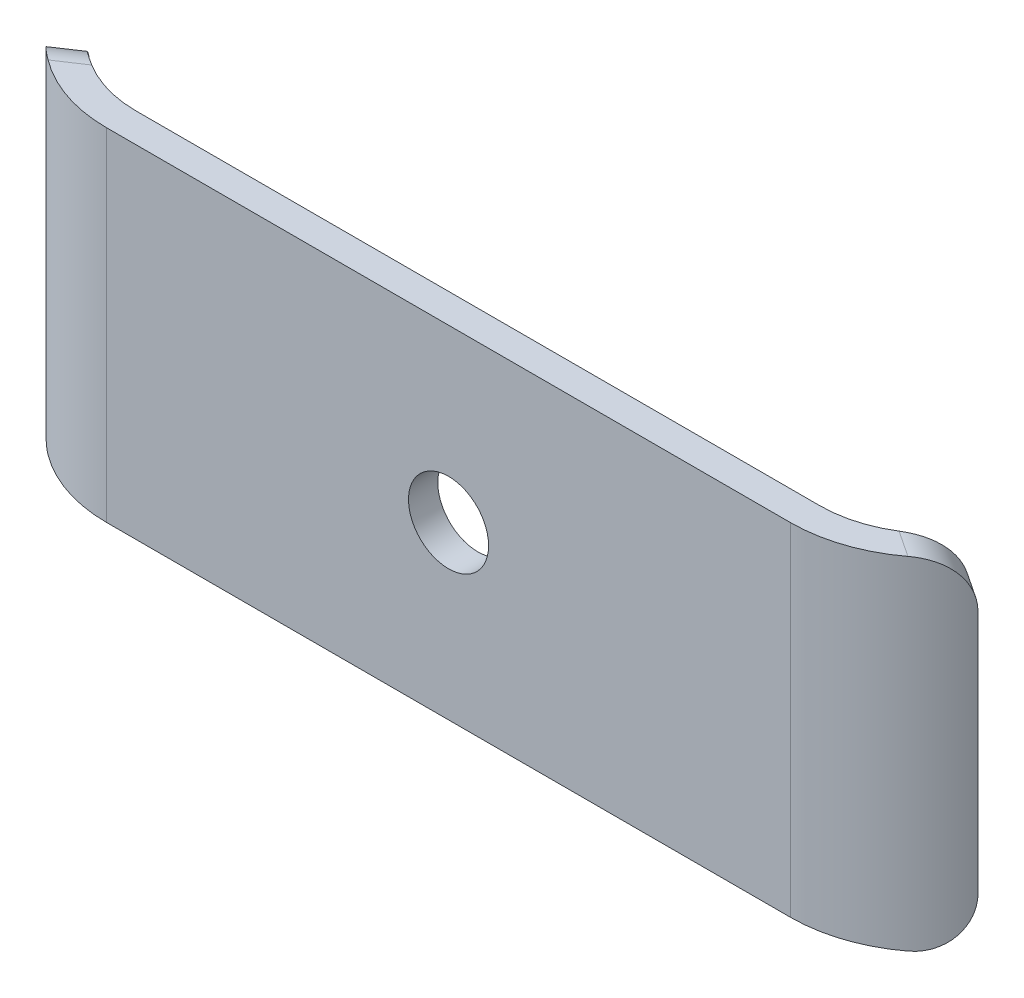
ISO-10303-21;
HEADER;
FILE_DESCRIPTION(('STEP AP214'),'2;1');
FILE_NAME('part.step','',(''),(''),'','','');
FILE_SCHEMA(('AUTOMOTIVE_DESIGN { 1 0 10303 214 1 1 1 1 }'));
ENDSEC;
DATA;
#1=APPLICATION_CONTEXT('core data for automotive mechanical design processes');
#2=APPLICATION_PROTOCOL_DEFINITION('international standard','automotive_design',2000,#1);
#3=PRODUCT_CONTEXT('',#1,'mechanical');
#4=PRODUCT('Part','Part','',(#3));
#5=PRODUCT_RELATED_PRODUCT_CATEGORY('part','',(#4));
#6=PRODUCT_DEFINITION_FORMATION('','',#4);
#7=PRODUCT_DEFINITION_CONTEXT('part definition',#1,'design');
#8=PRODUCT_DEFINITION('design','',#6,#7);
#9=PRODUCT_DEFINITION_SHAPE('','',#8);
#10=(LENGTH_UNIT() NAMED_UNIT(*) SI_UNIT(.MILLI.,.METRE.));
#11=(NAMED_UNIT(*) PLANE_ANGLE_UNIT() SI_UNIT($,.RADIAN.));
#12=(NAMED_UNIT(*) SI_UNIT($,.STERADIAN.) SOLID_ANGLE_UNIT());
#13=UNCERTAINTY_MEASURE_WITH_UNIT(LENGTH_MEASURE(1.E-05),#10,'distance_accuracy_value','');
#14=(GEOMETRIC_REPRESENTATION_CONTEXT(3) GLOBAL_UNCERTAINTY_ASSIGNED_CONTEXT((#13)) GLOBAL_UNIT_ASSIGNED_CONTEXT((#10,
#11,#12)) REPRESENTATION_CONTEXT('',''));
#15=CARTESIAN_POINT('',(0.,0.,0.));
#16=DIRECTION('',(0.,0.,1.));
#17=DIRECTION('',(1.,0.,0.));
#18=AXIS2_PLACEMENT_3D('',#15,#16,#17);
#19=CARTESIAN_POINT('',(-10.6944444444444,35.,-16.1224816197832));
#20=DIRECTION('',(-0.552770798392565,0.,-0.833333333333334));
#21=DIRECTION('',(-0.833333333333334,0.,0.552770798392566));
#22=AXIS2_PLACEMENT_3D('',#19,#20,#21);
#23=PLANE('',#22);
#24=DIRECTION('',(0.,-1.,0.));
#25=VECTOR('',#24,1.);
#26=CARTESIAN_POINT('',(-45.,35.,6.6332495807108));
#27=LINE('',#26,#25);
#28=CARTESIAN_POINT('',(-45.,30.,6.6332495807108));
#29=VERTEX_POINT('',#28);
#30=CARTESIAN_POINT('',(-45.,5.,6.6332495807108));
#31=VERTEX_POINT('',#30);
#32=EDGE_CURVE('E165',#29,#31,#27,.T.);
#33=ORIENTED_EDGE('',*,*,#32,.T.);
#34=DIRECTION('',(0.833333333333334,0.,-0.552770798392566));
#35=VECTOR('',#34,1.);
#36=CARTESIAN_POINT('',(-47.5,5.,8.2915619758885));
#37=LINE('',#36,#35);
#38=CARTESIAN_POINT('',(-47.5,5.,8.29156197588849));
#39=VERTEX_POINT('',#38);
#40=EDGE_CURVE('E55',#31,#39,#37,.F.);
#41=ORIENTED_EDGE('',*,*,#40,.T.);
#42=DIRECTION('',(0.,-1.,0.));
#43=VECTOR('',#42,1.);
#44=CARTESIAN_POINT('',(-47.5,35.,8.29156197588849));
#45=LINE('',#44,#43);
#46=CARTESIAN_POINT('',(-47.5,30.,8.29156197588849));
#47=VERTEX_POINT('',#46);
#48=EDGE_CURVE('E146',#47,#39,#45,.T.);
#49=ORIENTED_EDGE('',*,*,#48,.F.);
#50=DIRECTION('',(0.833333333333334,0.,-0.552770798392566));
#51=VECTOR('',#50,1.);
#52=CARTESIAN_POINT('',(-10.6944444444444,30.,-16.1224816197832));
#53=LINE('',#52,#51);
#54=EDGE_CURVE('E238',#47,#29,#53,.T.);
#55=ORIENTED_EDGE('',*,*,#54,.T.);
#56=EDGE_LOOP('',(#33,#41,#49,#55));
#57=FACE_BOUND('',#56,.T.);
#58=ADVANCED_FACE('F34',(#57),#23,.T.);
#59=CARTESIAN_POINT('',(-35.,35.,0.));
#60=DIRECTION('',(0.,-1.,0.));
#61=DIRECTION('',(0.,0.,-1.));
#62=AXIS2_PLACEMENT_3D('',#59,#60,#61);
#63=CYLINDRICAL_SURFACE('',#62,15.);
#64=ORIENTED_EDGE('',*,*,#48,.T.);
#65=CARTESIAN_POINT('',(-47.5,5.,8.2915619758885));
#66=CARTESIAN_POINT('',(-47.4999959600044,4.85952450066098,8.29154122913177));
#67=CARTESIAN_POINT('',(-47.4967275518829,4.71905115037134,8.29649453402392));
#68=CARTESIAN_POINT('',(-47.4836327346472,4.43910666598075,8.31619940728788));
#69=CARTESIAN_POINT('',(-47.4738066094585,4.29963548875356,8.33095055144841));
#70=CARTESIAN_POINT('',(-47.4475744420987,4.02275844835668,8.37009032989537));
#71=CARTESIAN_POINT('',(-47.4311720862223,3.88535147279545,8.39447356481753));
#72=CARTESIAN_POINT('',(-47.391732997827,3.61349931940472,8.45258502694666));
#73=CARTESIAN_POINT('',(-47.3686963468768,3.47905410518229,8.4863131392583));
#74=CARTESIAN_POINT('',(-47.3159121170527,3.21403082621614,8.56273683368021));
#75=CARTESIAN_POINT('',(-47.2861620687271,3.08345420453843,8.60543571519279));
#76=CARTESIAN_POINT('',(-47.2198706008423,2.82710507547343,8.69931400271356));
#77=CARTESIAN_POINT('',(-47.1833266754307,2.70133436139781,8.75049653707305));
#78=CARTESIAN_POINT('',(-47.1034068614244,2.45561532332307,8.86070938738571));
#79=CARTESIAN_POINT('',(-47.0600344493512,2.3356640769469,8.91973570753619));
#80=CARTESIAN_POINT('',(-46.9663774914936,2.10234451763328,9.04499443933699));
#81=CARTESIAN_POINT('',(-46.916090575915,1.98897848066212,9.1112293199336));
#82=CARTESIAN_POINT('',(-46.8088544055107,1.77022630840382,9.2497887845322));
#83=CARTESIAN_POINT('',(-46.7519380593788,1.66480470272382,9.3220828275773));
#84=CARTESIAN_POINT('',(-46.6312832131432,1.46211617420222,9.47219723110539));
#85=CARTESIAN_POINT('',(-46.5675448473463,1.36484909088774,9.5500174827824));
#86=CARTESIAN_POINT('',(-46.4333414512651,1.17917693624183,9.71028442248719));
#87=CARTESIAN_POINT('',(-46.3628767097675,1.09077148478347,9.79273091183189));
#88=CARTESIAN_POINT('',(-46.2154167685201,0.923477300848391,9.96127282448771));
#89=CARTESIAN_POINT('',(-46.1384240276875,0.844585011910064,10.0473668678059));
#90=CARTESIAN_POINT('',(-45.9796303128965,0.698182074974766,10.220629508476));
#91=CARTESIAN_POINT('',(-45.8979447010034,0.630487802322419,10.3077487280714));
#92=CARTESIAN_POINT('',(-45.7288785966837,0.505169925591379,10.4836079869945));
#93=CARTESIAN_POINT('',(-45.6415001937351,0.447542654799769,10.5723474231271));
#94=CARTESIAN_POINT('',(-45.4614002029752,0.34259613523206,10.7505884638469));
#95=CARTESIAN_POINT('',(-45.3686764912054,0.295281020191002,10.8400903591904));
#96=CARTESIAN_POINT('',(-45.1784626372279,0.211164264547766,11.0188911730773));
#97=CARTESIAN_POINT('',(-45.0809732614986,0.174360939770351,11.1081901218593));
#98=CARTESIAN_POINT('',(-44.8295222173874,0.094789713742336,11.3323303036856));
#99=CARTESIAN_POINT('',(-44.6727119550066,0.058983582434993,11.4665430070342));
#100=CARTESIAN_POINT('',(-44.4320644258624,0.0234434131472821,11.6639173234658));
#101=CARTESIAN_POINT('',(-44.3510012699965,0.0146246945527784,11.7290075694377));
#102=CARTESIAN_POINT('',(-44.1872718276632,0.0029039503455175,11.8576927202707));
#103=CARTESIAN_POINT('',(-44.1046055080057,2.04735980151942E-06,11.921287594113));
#104=CARTESIAN_POINT('',(-44.021259027813,0.,11.9840262663724));
#105=B_SPLINE_CURVE_WITH_KNOTS('',3,(#65,#66,#67,#68,#69,#70,#71,#72,#73,#74,#75,#76,#77,#78,
#79,#80,#81,#82,#83,#84,#85,#86,#87,#88,#89,#90,#91,#92,#93,#94,#95,#96,#97,#98,#99,#100,#101,
#102,#103,#104),.UNSPECIFIED.,.F.,.F.,(4,2,2,2,2,2,2,2,2,2,2,2,2,2,2,2,2,2,2,4),(0.,
0.421298173617721,0.842578107725069,1.26362222352308,1.68466116281056,2.10585522997914,
2.52720495962193,2.9483408611492,3.36962145921057,3.78889342404062,4.20815713607819,
4.62740285575349,5.0464913527826,5.45782348433233,5.86900548222117,6.28035200476779,
6.69163258528923,7.31819571357399,7.63104404912889,7.94389886845451),.UNSPECIFIED.);
#106=CARTESIAN_POINT('',(-44.021259027813,0.,11.9840262663724));
#107=VERTEX_POINT('',#106);
#108=EDGE_CURVE('E11',#39,#107,#105,.T.);
#109=ORIENTED_EDGE('',*,*,#108,.T.);
#110=CARTESIAN_POINT('',(-35.,0.,0.));
#111=DIRECTION('',(0.,1.,0.));
#112=DIRECTION('',(0.,0.,1.));
#113=AXIS2_PLACEMENT_3D('',#110,#111,#112);
#114=CIRCLE('',#113,15.);
#115=CARTESIAN_POINT('',(-35.,0.,15.));
#116=VERTEX_POINT('',#115);
#117=EDGE_CURVE('E143',#107,#116,#114,.T.);
#118=ORIENTED_EDGE('',*,*,#117,.T.);
#119=DIRECTION('',(0.,-1.,0.));
#120=VECTOR('',#119,1.);
#121=CARTESIAN_POINT('',(-35.,35.,15.));
#122=LINE('',#121,#120);
#123=CARTESIAN_POINT('',(-35.,35.,15.));
#124=VERTEX_POINT('',#123);
#125=EDGE_CURVE('E140',#124,#116,#122,.T.);
#126=ORIENTED_EDGE('',*,*,#125,.F.);
#127=CARTESIAN_POINT('',(-35.,35.,0.));
#128=DIRECTION('',(0.,1.,0.));
#129=DIRECTION('',(0.,0.,1.));
#130=AXIS2_PLACEMENT_3D('',#127,#128,#129);
#131=CIRCLE('',#130,15.);
#132=CARTESIAN_POINT('',(-44.021259027813,35.,11.9840262663724));
#133=VERTEX_POINT('',#132);
#134=EDGE_CURVE('E127',#133,#124,#131,.T.);
#135=ORIENTED_EDGE('',*,*,#134,.F.);
#136=CARTESIAN_POINT('',(-44.021259027813,35.,11.9840262663724));
#137=CARTESIAN_POINT('',(-44.1330426986423,35.0000160469528,11.8999005498065));
#138=CARTESIAN_POINT('',(-44.2436451202211,34.9947811734468,11.8141707662597));
#139=CARTESIAN_POINT('',(-44.4618213708839,34.9736024125125,11.6401576886565));
#140=CARTESIAN_POINT('',(-44.5693943214265,34.9576554512484,11.5518736686215));
#141=CARTESIAN_POINT('',(-44.7807914402866,34.9148428926643,11.3734466343729));
#142=CARTESIAN_POINT('',(-44.8846152213656,34.8879761709725,11.2833034296328));
#143=CARTESIAN_POINT('',(-45.0878312839607,34.8232587678086,11.1019904168848));
#144=CARTESIAN_POINT('',(-45.1872240894788,34.7854093891289,11.010820731873));
#145=CARTESIAN_POINT('',(-45.3811878631784,34.6986857819487,10.8281451281767));
#146=CARTESIAN_POINT('',(-45.47574842665,34.6497888991357,10.7366389041227));
#147=CARTESIAN_POINT('',(-45.6593276056514,34.5411800030626,10.5544052485915));
#148=CARTESIAN_POINT('',(-45.7483441279396,34.4814639377139,10.4636781222882));
#149=CARTESIAN_POINT('',(-45.9202543092094,34.3516207001199,10.2841372273396));
#150=CARTESIAN_POINT('',(-46.0031547509146,34.2815053287039,10.1953214189261));
#151=CARTESIAN_POINT('',(-46.1626252824226,34.1312257063528,10.0204693278883));
#152=CARTESIAN_POINT('',(-46.2391930299028,34.0510577645378,9.93443408083683));
#153=CARTESIAN_POINT('',(-46.3836343589439,33.8836516463785,9.76855276541122));
#154=CARTESIAN_POINT('',(-46.4516927334533,33.7966779508479,9.68860042676208));
#155=CARTESIAN_POINT('',(-46.5814345688103,33.6143382272442,9.5331332797022));
#156=CARTESIAN_POINT('',(-46.643115715225,33.5189691754027,9.45762008661192));
#157=CARTESIAN_POINT('',(-46.7599933515262,33.3205217451959,9.31188939087174));
#158=CARTESIAN_POINT('',(-46.8151897061049,33.2174432060426,9.24167199873181));
#159=CARTESIAN_POINT('',(-46.9190901142709,33.0042523249075,9.10727787347036));
#160=CARTESIAN_POINT('',(-46.9677917639506,32.894137400707,9.04310337959654));
#161=CARTESIAN_POINT('',(-47.0591598190967,32.6665095838082,8.92090503395355));
#162=CARTESIAN_POINT('',(-47.101759635887,32.5489327158492,8.86295055539996));
#163=CARTESIAN_POINT('',(-47.1803894243705,32.3081838661231,8.7545758606092));
#164=CARTESIAN_POINT('',(-47.2164168184993,32.1850097127732,8.70415860170245));
#165=CARTESIAN_POINT('',(-47.2819249980422,31.9340327715564,8.61147734486448));
#166=CARTESIAN_POINT('',(-47.3114100397648,31.8062330563048,8.56920804841427));
#167=CARTESIAN_POINT('',(-47.3639351064944,31.5468109676147,8.49324611003737));
#168=CARTESIAN_POINT('',(-47.3869734449399,31.415187603771,8.45955571269593));
#169=CARTESIAN_POINT('',(-47.4379706868309,31.0731310093176,8.3845118918192));
#170=CARTESIAN_POINT('',(-47.4612671490643,30.8604805664541,8.3497106356853));
#171=CARTESIAN_POINT('',(-47.484523567021,30.5390645387707,8.31485617552438));
#172=CARTESIAN_POINT('',(-47.4903276677327,30.4315416621208,8.30612927198363));
#173=CARTESIAN_POINT('',(-47.4980639982326,30.2160256260807,8.29448161873067));
#174=CARTESIAN_POINT('',(-47.4999956053245,30.1080323938549,8.2915618027975));
#175=CARTESIAN_POINT('',(-47.5,30.,8.29156197588849));
#176=B_SPLINE_CURVE_WITH_KNOTS('',3,(#136,#137,#138,#139,#140,#141,#142,#143,#144,#145,#146,
#147,#148,#149,#150,#151,#152,#153,#154,#155,#156,#157,#158,#159,#160,#161,#162,#163,#164,#165,
#166,#167,#168,#169,#170,#171,#172,#173,#174,#175),.UNSPECIFIED.,.F.,.F.,(4,2,2,2,2,2,2,2,2,2,2,
2,2,2,2,2,2,2,2,4),(0.,0.419626407665895,0.839373278685139,1.25916338060699,1.67890370623697,
2.09951270332631,2.52027955720327,2.94057253941156,3.36102028981556,3.76956257910139,
4.17825262049012,4.58695118784864,4.99580061083943,5.40881810291968,5.82199722508333,
6.23490674880654,6.64792419553029,7.29601308354458,7.61992335595735,7.94388570889538),.UNSPECIFIED.);
#177=EDGE_CURVE('E48',#133,#47,#176,.T.);
#178=ORIENTED_EDGE('',*,*,#177,.T.);
#179=EDGE_LOOP('',(#64,#109,#118,#126,#135,#178));
#180=FACE_BOUND('',#179,.T.);
#181=ADVANCED_FACE('F141',(#180),#63,.T.);
#182=CARTESIAN_POINT('',(0.,35.,15.));
#183=DIRECTION('',(0.,0.,-1.));
#184=DIRECTION('',(-1.,0.,0.));
#185=AXIS2_PLACEMENT_3D('',#182,#183,#184);
#186=PLANE('',#185);
#187=CARTESIAN_POINT('',(0.,17.5,15.));
#188=DIRECTION('',(0.,0.,1.));
#189=DIRECTION('',(1.,0.,0.));
#190=AXIS2_PLACEMENT_3D('',#187,#188,#189);
#191=CIRCLE('',#190,4.1);
#192=CARTESIAN_POINT('',(4.1,17.5,15.));
#193=VERTEX_POINT('',#192);
#194=EDGE_CURVE('E168',#193,#193,#191,.T.);
#195=ORIENTED_EDGE('',*,*,#194,.F.);
#196=EDGE_LOOP('',(#195));
#197=FACE_BOUND('',#196,.T.);
#198=DIRECTION('',(1.,0.,0.));
#199=VECTOR('',#198,1.);
#200=CARTESIAN_POINT('',(0.,0.,15.));
#201=LINE('',#200,#199);
#202=CARTESIAN_POINT('',(35.,0.,15.));
#203=VERTEX_POINT('',#202);
#204=EDGE_CURVE('E167',#116,#203,#201,.T.);
#205=ORIENTED_EDGE('',*,*,#204,.T.);
#206=DIRECTION('',(0.,-1.,0.));
#207=VECTOR('',#206,1.);
#208=CARTESIAN_POINT('',(35.,35.,15.));
#209=LINE('',#208,#207);
#210=CARTESIAN_POINT('',(35.,35.,15.));
#211=VERTEX_POINT('',#210);
#212=EDGE_CURVE('E147',#211,#203,#209,.T.);
#213=ORIENTED_EDGE('',*,*,#212,.F.);
#214=DIRECTION('',(1.,0.,0.));
#215=VECTOR('',#214,1.);
#216=CARTESIAN_POINT('',(0.,35.,15.));
#217=LINE('',#216,#215);
#218=EDGE_CURVE('E132',#124,#211,#217,.T.);
#219=ORIENTED_EDGE('',*,*,#218,.F.);
#220=ORIENTED_EDGE('',*,*,#125,.T.);
#221=EDGE_LOOP('',(#205,#213,#219,#220));
#222=FACE_BOUND('',#221,.T.);
#223=ADVANCED_FACE('F149',(#197,#222),#186,.F.);
#224=CARTESIAN_POINT('',(35.,35.,0.));
#225=DIRECTION('',(0.,-1.,0.));
#226=DIRECTION('',(0.,0.,-1.));
#227=AXIS2_PLACEMENT_3D('',#224,#225,#226);
#228=CYLINDRICAL_SURFACE('',#227,15.);
#229=CARTESIAN_POINT('',(35.,0.,0.));
#230=DIRECTION('',(0.,1.,0.));
#231=DIRECTION('',(0.,0.,1.));
#232=AXIS2_PLACEMENT_3D('',#229,#230,#231);
#233=CIRCLE('',#232,15.);
#234=CARTESIAN_POINT('',(44.021259027813,0.,11.9840262663724));
#235=VERTEX_POINT('',#234);
#236=EDGE_CURVE('E170',#203,#235,#233,.T.);
#237=ORIENTED_EDGE('',*,*,#236,.T.);
#238=CARTESIAN_POINT('',(44.021259027813,0.,11.9840262663724));
#239=CARTESIAN_POINT('',(44.1330426986423,-1.60469528417835E-05,11.8999005498065));
#240=CARTESIAN_POINT('',(44.2436451202211,0.00521882655324744,11.8141707662597));
#241=CARTESIAN_POINT('',(44.4618213708839,0.0263975874875162,11.6401576886565));
#242=CARTESIAN_POINT('',(44.5693943214265,0.0423445487515494,11.5518736686214));
#243=CARTESIAN_POINT('',(44.7807914402866,0.0851571073357199,11.3734466343729));
#244=CARTESIAN_POINT('',(44.8846152213656,0.112023829027523,11.2833034296328));
#245=CARTESIAN_POINT('',(45.0878312839607,0.176741232191436,11.1019904168848));
#246=CARTESIAN_POINT('',(45.1872240894788,0.214590610871133,11.010820731873));
#247=CARTESIAN_POINT('',(45.3811878631784,0.301314218051337,10.8281451281767));
#248=CARTESIAN_POINT('',(45.47574842665,0.350211100864303,10.7366389041227));
#249=CARTESIAN_POINT('',(45.6593276056514,0.458819996937447,10.5544052485914));
#250=CARTESIAN_POINT('',(45.7483441279396,0.518536062286124,10.4636781222882));
#251=CARTESIAN_POINT('',(45.9202543092094,0.64837929988007,10.2841372273396));
#252=CARTESIAN_POINT('',(46.0031547509146,0.718494671296088,10.1953214189261));
#253=CARTESIAN_POINT('',(46.1626252824226,0.868774293647157,10.0204693278883));
#254=CARTESIAN_POINT('',(46.2391930299028,0.948942235462204,9.93443408083682));
#255=CARTESIAN_POINT('',(46.3836343589439,1.11634835362146,9.76855276541121));
#256=CARTESIAN_POINT('',(46.4516927334533,1.20332204915208,9.68860042676207));
#257=CARTESIAN_POINT('',(46.5814345688103,1.38566177275578,9.53313327970219));
#258=CARTESIAN_POINT('',(46.643115715225,1.48103082459733,9.45762008661191));
#259=CARTESIAN_POINT('',(46.7599933515262,1.67947825480407,9.31188939087173));
#260=CARTESIAN_POINT('',(46.8151897061049,1.78255679395742,9.2416719987318));
#261=CARTESIAN_POINT('',(46.9190901142709,1.99574767509254,9.10727787347036));
#262=CARTESIAN_POINT('',(46.9677917639506,2.10586259929303,9.04310337959653));
#263=CARTESIAN_POINT('',(47.0591598190967,2.33349041619176,8.92090503395354));
#264=CARTESIAN_POINT('',(47.101759635887,2.45106728415084,8.86295055539994));
#265=CARTESIAN_POINT('',(47.1803894243705,2.69181613387693,8.75457586060918));
#266=CARTESIAN_POINT('',(47.2164168184993,2.81499028722681,8.70415860170245));
#267=CARTESIAN_POINT('',(47.2819249980422,3.06596722844359,8.61147734486448));
#268=CARTESIAN_POINT('',(47.3114100397648,3.19376694369515,8.56920804841426));
#269=CARTESIAN_POINT('',(47.3639351064944,3.45318903238526,8.49324611003736));
#270=CARTESIAN_POINT('',(47.3869734449399,3.58481239622905,8.45955571269592));
#271=CARTESIAN_POINT('',(47.4379706868309,3.92686899068236,8.3845118918192));
#272=CARTESIAN_POINT('',(47.4612671490643,4.1395194335459,8.3497106356853));
#273=CARTESIAN_POINT('',(47.484523567021,4.46093546122934,8.31485617552438));
#274=CARTESIAN_POINT('',(47.4903276677327,4.56845833787925,8.30612927198362));
#275=CARTESIAN_POINT('',(47.4980639982326,4.78397437391934,8.29448161873066));
#276=CARTESIAN_POINT('',(47.4999956053245,4.89196760614509,8.29156180279749));
#277=CARTESIAN_POINT('',(47.5,5.,8.29156197588849));
#278=B_SPLINE_CURVE_WITH_KNOTS('',3,(#238,#239,#240,#241,#242,#243,#244,#245,#246,#247,#248,
#249,#250,#251,#252,#253,#254,#255,#256,#257,#258,#259,#260,#261,#262,#263,#264,#265,#266,#267,
#268,#269,#270,#271,#272,#273,#274,#275,#276,#277),.UNSPECIFIED.,.F.,.F.,(4,2,2,2,2,2,2,2,2,2,2,
2,2,2,2,2,2,2,2,4),(0.,0.419626407665895,0.839373278685143,1.25916338060699,1.67890370623697,
2.09951270332631,2.52027955720327,2.94057253941155,3.36102028981556,3.76956257910139,
4.17825262049012,4.58695118784863,4.99580061083944,5.40881810291969,5.82199722508333,
6.23490674880653,6.64792419553029,7.29601308354458,7.61992335595735,7.94388570889537),.UNSPECIFIED.);
#279=CARTESIAN_POINT('',(47.5,5.,8.29156197588848));
#280=VERTEX_POINT('',#279);
#281=EDGE_CURVE('E208',#235,#280,#278,.T.);
#282=ORIENTED_EDGE('',*,*,#281,.T.);
#283=DIRECTION('',(0.,-1.,0.));
#284=VECTOR('',#283,1.);
#285=CARTESIAN_POINT('',(47.5,35.,8.29156197588848));
#286=LINE('',#285,#284);
#287=CARTESIAN_POINT('',(47.5,30.,8.29156197588848));
#288=VERTEX_POINT('',#287);
#289=EDGE_CURVE('E189',#288,#280,#286,.T.);
#290=ORIENTED_EDGE('',*,*,#289,.F.);
#291=CARTESIAN_POINT('',(47.5,30.,8.29156197588848));
#292=CARTESIAN_POINT('',(47.4999959600044,30.140475499339,8.29154122913175));
#293=CARTESIAN_POINT('',(47.4967275518829,30.2809488496287,8.29649453402391));
#294=CARTESIAN_POINT('',(47.4836327346472,30.5608933340192,8.31619940728788));
#295=CARTESIAN_POINT('',(47.4738066094585,30.7003645112464,8.3309505514484));
#296=CARTESIAN_POINT('',(47.4475744420987,30.9772415516433,8.37009032989537));
#297=CARTESIAN_POINT('',(47.4311720862223,31.1146485272046,8.39447356481753));
#298=CARTESIAN_POINT('',(47.391732997827,31.3865006805953,8.45258502694666));
#299=CARTESIAN_POINT('',(47.3686963468768,31.5209458948177,8.4863131392583));
#300=CARTESIAN_POINT('',(47.3159121170527,31.7859691737839,8.56273683368021));
#301=CARTESIAN_POINT('',(47.2861620687271,31.9165457954616,8.60543571519278));
#302=CARTESIAN_POINT('',(47.2198706008423,32.1728949245266,8.69931400271355));
#303=CARTESIAN_POINT('',(47.1833266754307,32.2986656386022,8.75049653707304));
#304=CARTESIAN_POINT('',(47.1034068614244,32.5443846766769,8.86070938738571));
#305=CARTESIAN_POINT('',(47.0600344493512,32.6643359230531,8.91973570753619));
#306=CARTESIAN_POINT('',(46.9663774914936,32.8976554823667,9.04499443933698));
#307=CARTESIAN_POINT('',(46.916090575915,33.0110215193379,9.11122931993359));
#308=CARTESIAN_POINT('',(46.8088544055107,33.2297736915962,9.24978878453219));
#309=CARTESIAN_POINT('',(46.7519380593788,33.3351952972762,9.3220828275773));
#310=CARTESIAN_POINT('',(46.6312832131432,33.5378838257978,9.47219723110539));
#311=CARTESIAN_POINT('',(46.5675448473463,33.6351509091123,9.55001748278239));
#312=CARTESIAN_POINT('',(46.4333414512651,33.8208230637582,9.71028442248718));
#313=CARTESIAN_POINT('',(46.3628767097675,33.9092285152165,9.79273091183189));
#314=CARTESIAN_POINT('',(46.2154167685201,34.0765226991516,9.96127282448771));
#315=CARTESIAN_POINT('',(46.1384240276875,34.1554149880899,10.0473668678059));
#316=CARTESIAN_POINT('',(45.9796303128965,34.3018179250252,10.220629508476));
#317=CARTESIAN_POINT('',(45.8979447010034,34.3695121976776,10.3077487280714));
#318=CARTESIAN_POINT('',(45.7288785966837,34.4948300744086,10.4836079869945));
#319=CARTESIAN_POINT('',(45.6415001937351,34.5524573452002,10.5723474231271));
#320=CARTESIAN_POINT('',(45.4614002029752,34.657403864768,10.7505884638469));
#321=CARTESIAN_POINT('',(45.3686764912054,34.704718979809,10.8400903591904));
#322=CARTESIAN_POINT('',(45.1784626372278,34.7888357354522,11.0188911730773));
#323=CARTESIAN_POINT('',(45.0809732614986,34.8256390602297,11.1081901218593));
#324=CARTESIAN_POINT('',(44.8295222173874,34.9052102862577,11.3323303036856));
#325=CARTESIAN_POINT('',(44.6727119550066,34.941016417565,11.4665430070342));
#326=CARTESIAN_POINT('',(44.4320644258624,34.9765565868527,11.6639173234658));
#327=CARTESIAN_POINT('',(44.3510012699965,34.9853753054472,11.7290075694377));
#328=CARTESIAN_POINT('',(44.1872718276632,34.9970960496545,11.8576927202707));
#329=CARTESIAN_POINT('',(44.1046055080057,34.9999979526402,11.921287594113));
#330=CARTESIAN_POINT('',(44.021259027813,35.,11.9840262663724));
#331=B_SPLINE_CURVE_WITH_KNOTS('',3,(#291,#292,#293,#294,#295,#296,#297,#298,#299,#300,#301,
#302,#303,#304,#305,#306,#307,#308,#309,#310,#311,#312,#313,#314,#315,#316,#317,#318,#319,#320,
#321,#322,#323,#324,#325,#326,#327,#328,#329,#330),.UNSPECIFIED.,.F.,.F.,(4,2,2,2,2,2,2,2,2,2,2,
2,2,2,2,2,2,2,2,4),(0.,0.421298173617718,0.842578107725065,1.26362222352308,1.68466116281057,
2.10585522997913,2.52720495962193,2.94834086114919,3.36962145921058,3.78889342404063,
4.20815713607819,4.62740285575349,5.04649135278261,5.45782348433234,5.86900548222118,
6.28035200476781,6.69163258528924,7.318195713574,7.6310440491289,7.94389886845451),.UNSPECIFIED.);
#332=CARTESIAN_POINT('',(44.021259027813,35.,11.9840262663724));
#333=VERTEX_POINT('',#332);
#334=EDGE_CURVE('E200',#288,#333,#331,.T.);
#335=ORIENTED_EDGE('',*,*,#334,.T.);
#336=CARTESIAN_POINT('',(35.,35.,0.));
#337=DIRECTION('',(0.,1.,0.));
#338=DIRECTION('',(0.,0.,1.));
#339=AXIS2_PLACEMENT_3D('',#336,#337,#338);
#340=CIRCLE('',#339,15.);
#341=EDGE_CURVE('E152',#211,#333,#340,.T.);
#342=ORIENTED_EDGE('',*,*,#341,.F.);
#343=ORIENTED_EDGE('',*,*,#212,.T.);
#344=EDGE_LOOP('',(#237,#282,#290,#335,#342,#343));
#345=FACE_BOUND('',#344,.T.);
#346=ADVANCED_FACE('F217',(#345),#228,.T.);
#347=CARTESIAN_POINT('',(10.6944444444445,35.,-16.1224816197832));
#348=DIRECTION('',(0.552770798392567,0.,-0.833333333333333));
#349=DIRECTION('',(-0.833333333333333,0.,-0.552770798392567));
#350=AXIS2_PLACEMENT_3D('',#347,#348,#349);
#351=PLANE('',#350);
#352=ORIENTED_EDGE('',*,*,#289,.T.);
#353=DIRECTION('',(0.833333333333333,0.,0.552770798392567));
#354=VECTOR('',#353,1.);
#355=CARTESIAN_POINT('',(45.,5.,6.63324958071078));
#356=LINE('',#355,#354);
#357=CARTESIAN_POINT('',(45.,5.,6.63324958071079));
#358=VERTEX_POINT('',#357);
#359=EDGE_CURVE('E316',#280,#358,#356,.F.);
#360=ORIENTED_EDGE('',*,*,#359,.T.);
#361=DIRECTION('',(0.,-1.,0.));
#362=VECTOR('',#361,1.);
#363=CARTESIAN_POINT('',(45.,35.,6.63324958071079));
#364=LINE('',#363,#362);
#365=CARTESIAN_POINT('',(45.,30.,6.63324958071079));
#366=VERTEX_POINT('',#365);
#367=EDGE_CURVE('E186',#366,#358,#364,.T.);
#368=ORIENTED_EDGE('',*,*,#367,.F.);
#369=DIRECTION('',(0.833333333333333,0.,0.552770798392567));
#370=VECTOR('',#369,1.);
#371=CARTESIAN_POINT('',(10.6944444444445,30.,-16.1224816197832));
#372=LINE('',#371,#370);
#373=EDGE_CURVE('E425',#366,#288,#372,.T.);
#374=ORIENTED_EDGE('',*,*,#373,.T.);
#375=EDGE_LOOP('',(#352,#360,#368,#374));
#376=FACE_BOUND('',#375,.T.);
#377=ADVANCED_FACE('F222',(#376),#351,.T.);
#378=CARTESIAN_POINT('',(35.,35.,0.));
#379=DIRECTION('',(0.,-1.,0.));
#380=DIRECTION('',(0.,0.,-1.));
#381=AXIS2_PLACEMENT_3D('',#378,#379,#380);
#382=CYLINDRICAL_SURFACE('',#381,12.);
#383=ORIENTED_EDGE('',*,*,#367,.T.);
#384=CARTESIAN_POINT('',(45.,5.,6.63324958071079));
#385=CARTESIAN_POINT('',(44.9999928865899,4.85961179738057,6.6332268403551));
#386=CARTESIAN_POINT('',(44.9967315206142,4.71922573225971,6.6381759474066));
#387=CARTESIAN_POINT('',(44.9836487922906,4.43945359965288,6.65785363231165));
#388=CARTESIAN_POINT('',(44.9738276967787,4.30006749172386,6.67258181237297));
#389=CARTESIAN_POINT('',(44.9475798783966,4.02334111549663,6.71164473432327));
#390=CARTESIAN_POINT('',(44.9311561025092,3.88599996279403,6.73597519032778));
#391=CARTESIAN_POINT('',(44.8916055642976,3.61427520091836,6.79392207117947));
#392=CARTESIAN_POINT('',(44.8684788847439,3.4798915552467,6.8275383813605));
#393=CARTESIAN_POINT('',(44.8153884997008,3.21498089354191,6.90364382515654));
#394=CARTESIAN_POINT('',(44.785421956819,3.08445550348816,6.94613664040569));
#395=CARTESIAN_POINT('',(44.7185039160662,2.82820975516188,7.03945864713318));
#396=CARTESIAN_POINT('',(44.6815499831006,2.70249109044336,7.0902907440184));
#397=CARTESIAN_POINT('',(44.600530909876,2.45685436525867,7.19961325981339));
#398=CARTESIAN_POINT('',(44.5564679290189,2.33693455769749,7.25810135216894));
#399=CARTESIAN_POINT('',(44.4610918741119,2.10373609198852,7.38199492958901));
#400=CARTESIAN_POINT('',(44.4097789794202,1.99045726964512,7.44740024351587));
#401=CARTESIAN_POINT('',(44.3001875136151,1.77214164906293,7.58380577083426));
#402=CARTESIAN_POINT('',(44.2419599039316,1.66705297839269,7.6547638799248));
#403=CARTESIAN_POINT('',(44.1182396529358,1.46506305685307,7.80172576805725));
#404=CARTESIAN_POINT('',(44.0527497048138,1.36815879417953,7.8777276724702));
#405=CARTESIAN_POINT('',(43.9145424148677,1.18323042204331,8.03379060550189));
#406=CARTESIAN_POINT('',(43.8418270366604,1.09520391295285,8.11385052841273));
#407=CARTESIAN_POINT('',(43.6892889712529,0.928629531077078,8.27699970939033));
#408=CARTESIAN_POINT('',(43.6094665456622,0.850081309647571,8.3600888558853));
#409=CARTESIAN_POINT('',(43.4453932810864,0.705130373103067,8.52575635194132));
#410=CARTESIAN_POINT('',(43.361340012894,0.63843981522728,8.60827867546183));
#411=CARTESIAN_POINT('',(43.1870676408517,0.514812099543892,8.77418962246914));
#412=CARTESIAN_POINT('',(43.0968463747591,0.457878386860451,8.85757854097084));
#413=CARTESIAN_POINT('',(42.9106732156429,0.354011083567946,9.02423670688738));
#414=CARTESIAN_POINT('',(42.81472023567,0.307079397478092,9.1075059285175));
#415=CARTESIAN_POINT('',(42.6176279768253,0.223306004033272,9.27298994817135));
#416=CARTESIAN_POINT('',(42.5164870748823,0.186467477522719,9.35520440602504));
#417=CARTESIAN_POINT('',(42.2423266958465,0.102185550961962,9.57056038170598));
#418=CARTESIAN_POINT('',(42.0652777010523,0.0633879295591318,9.70210688037878));
#419=CARTESIAN_POINT('',(41.7928872614112,0.0250751888539002,9.89287786568501));
#420=CARTESIAN_POINT('',(41.7010229057611,0.0156178953988214,9.95533409976331));
#421=CARTESIAN_POINT('',(41.5153018141371,0.00308227008763158,10.0778573808847));
#422=CARTESIAN_POINT('',(41.4214453333878,3.12600768479078E-06,10.137924731184));
#423=CARTESIAN_POINT('',(41.3267394369003,0.,10.1966841717085));
#424=B_SPLINE_CURVE_WITH_KNOTS('',3,(#384,#385,#386,#387,#388,#389,#390,#391,#392,#393,#394,
#395,#396,#397,#398,#399,#400,#401,#402,#403,#404,#405,#406,#407,#408,#409,#410,#411,#412,#413,
#414,#415,#416,#417,#418,#419,#420,#421,#422,#423),.UNSPECIFIED.,.F.,.F.,(4,2,2,2,2,2,2,2,2,2,2,
2,2,2,2,2,2,2,2,4),(0.,0.421036534247229,0.842055942657767,1.26288764520272,1.68371415134983,
2.10471554799917,2.52586393430789,2.94688463510953,3.36789492195396,3.7859752708498,
4.20390109264253,4.6217136459795,5.03951082603781,5.44509907675618,5.85083024617783,
6.25663860333363,6.66257470367571,7.33209329708693,7.66637139590018,8.00060692353493),.UNSPECIFIED.);
#425=CARTESIAN_POINT('',(41.3267394369003,0.,10.1966841717085));
#426=VERTEX_POINT('',#425);
#427=EDGE_CURVE('E291',#358,#426,#424,.T.);
#428=ORIENTED_EDGE('',*,*,#427,.T.);
#429=CARTESIAN_POINT('',(35.,0.,0.));
#430=DIRECTION('',(0.,1.,0.));
#431=DIRECTION('',(0.,0.,1.));
#432=AXIS2_PLACEMENT_3D('',#429,#430,#431);
#433=CIRCLE('',#432,12.);
#434=CARTESIAN_POINT('',(35.,0.,12.));
#435=VERTEX_POINT('',#434);
#436=EDGE_CURVE('E173',#435,#426,#433,.T.);
#437=ORIENTED_EDGE('',*,*,#436,.F.);
#438=DIRECTION('',(0.,-1.,0.));
#439=VECTOR('',#438,1.);
#440=CARTESIAN_POINT('',(35.,35.,12.));
#441=LINE('',#440,#439);
#442=CARTESIAN_POINT('',(35.,35.,12.));
#443=VERTEX_POINT('',#442);
#444=EDGE_CURVE('E184',#443,#435,#441,.T.);
#445=ORIENTED_EDGE('',*,*,#444,.F.);
#446=CARTESIAN_POINT('',(35.,35.,0.));
#447=DIRECTION('',(0.,1.,0.));
#448=DIRECTION('',(0.,0.,1.));
#449=AXIS2_PLACEMENT_3D('',#446,#447,#448);
#450=CIRCLE('',#449,12.);
#451=CARTESIAN_POINT('',(41.3267394369003,35.,10.1966841717085));
#452=VERTEX_POINT('',#451);
#453=EDGE_CURVE('E154',#443,#452,#450,.T.);
#454=ORIENTED_EDGE('',*,*,#453,.T.);
#455=CARTESIAN_POINT('',(41.3267394369003,35.,10.1966841717085));
#456=CARTESIAN_POINT('',(41.4453001771011,35.0000156898325,10.1231448365991));
#457=CARTESIAN_POINT('',(41.5625829812031,34.9951749070334,10.0474876727837));
#458=CARTESIAN_POINT('',(41.7939122824658,34.9754130218185,9.89252321383947));
#459=CARTESIAN_POINT('',(41.9079573054503,34.9604874020647,9.81321429780931));
#460=CARTESIAN_POINT('',(42.1320950052484,34.920174852854,9.65154696869949));
#461=CARTESIAN_POINT('',(42.2421850951042,34.8947812069011,9.56918662869985));
#462=CARTESIAN_POINT('',(42.4575982116147,34.8333156989995,9.4022753797922));
#463=CARTESIAN_POINT('',(42.5629220410504,34.7972456430534,9.31772484357941));
#464=CARTESIAN_POINT('',(42.7684778181641,34.7142087989428,9.14705727136718));
#465=CARTESIAN_POINT('',(42.8686925818102,34.6672078595381,9.06093612199893));
#466=CARTESIAN_POINT('',(43.0630707635683,34.5624468313277,8.88840694977903));
#467=CARTESIAN_POINT('',(43.1572342589608,34.5046868799615,8.80199893060581));
#468=CARTESIAN_POINT('',(43.3389184999996,34.3787097322931,8.63006761826181));
#469=CARTESIAN_POINT('',(43.4264462082416,34.3105037300444,8.54454348142201));
#470=CARTESIAN_POINT('',(43.5945899398495,34.1639771192295,8.37539530232868));
#471=CARTESIAN_POINT('',(43.675206275636,34.0856569682632,8.29177117431318));
#472=CARTESIAN_POINT('',(43.8259839385121,33.9229721673835,8.13102894439732));
#473=CARTESIAN_POINT('',(43.8964446547371,33.8390082297835,8.05378549684603));
#474=CARTESIAN_POINT('',(44.0307001646532,33.6628058619423,7.90295222201279));
#475=CARTESIAN_POINT('',(44.0944926928717,33.5705646392014,7.82936364087539));
#476=CARTESIAN_POINT('',(44.2153472887066,33.3784488724513,7.68674926996606));
#477=CARTESIAN_POINT('',(44.2724087666441,33.2785736609217,7.61772388018857));
#478=CARTESIAN_POINT('',(44.3798466128286,33.0718312598799,7.48503643915894));
#479=CARTESIAN_POINT('',(44.4302199178489,32.9649608997701,7.42137685031936));
#480=CARTESIAN_POINT('',(44.5249878077565,32.7434521283587,7.2993602678833));
#481=CARTESIAN_POINT('',(44.5692887697149,32.6287258801211,7.24109003361745));
#482=CARTESIAN_POINT('',(44.6511799846867,32.3936604326136,7.13157780728158));
#483=CARTESIAN_POINT('',(44.6887701091603,32.2733211258863,7.080335949838));
#484=CARTESIAN_POINT('',(44.7573693594228,32.027851069809,6.98549711359781));
#485=CARTESIAN_POINT('',(44.7883784304007,31.9027202805629,6.94190019847342));
#486=CARTESIAN_POINT('',(44.8439358055693,31.6485566269215,6.86289019254706));
#487=CARTESIAN_POINT('',(44.8684867000601,31.5195253501898,6.82747382132036));
#488=CARTESIAN_POINT('',(44.9083345275379,31.2762546062568,6.76948795411407));
#489=CARTESIAN_POINT('',(44.9244378729795,31.1624057102554,6.74582389332662));
#490=CARTESIAN_POINT('',(44.9519929874173,30.9329843354947,6.70510530332422));
#491=CARTESIAN_POINT('',(44.9634452127192,30.8174120269675,6.68805012574148));
#492=CARTESIAN_POINT('',(44.9817440836233,30.5851630596057,6.66071101223155));
#493=CARTESIAN_POINT('',(44.9885928476198,30.4684869338204,6.65042396183286));
#494=CARTESIAN_POINT('',(44.997719301154,30.23454102525,6.63668733767704));
#495=CARTESIAN_POINT('',(44.9999964467551,30.1172711734867,6.63323857754848));
#496=CARTESIAN_POINT('',(45.,30.,6.63324958071079));
#497=B_SPLINE_CURVE_WITH_KNOTS('',3,(#455,#456,#457,#458,#459,#460,#461,#462,#463,#464,#465,
#466,#467,#468,#469,#470,#471,#472,#473,#474,#475,#476,#477,#478,#479,#480,#481,#482,#483,#484,
#485,#486,#487,#488,#489,#490,#491,#492,#493,#494,#495,#496),.UNSPECIFIED.,.F.,.F.,(4,2,2,2,2,2,
2,2,2,2,2,2,2,2,2,2,2,2,2,2,4),(0.,0.418487000886693,0.837161580577303,1.25610520944339,
1.67497801100478,2.09517750318725,2.51537162796059,2.93511858060318,3.35484654905606,
3.75665833559753,4.15860619434262,4.56058923993495,4.96275576590955,5.37055521815809,
5.77836248059185,6.18617313935842,6.59381997971209,6.94571328615387,7.29757206118109,
7.64926880881356,8.00100739926777),.UNSPECIFIED.);
#498=EDGE_CURVE('E290',#452,#366,#497,.T.);
#499=ORIENTED_EDGE('',*,*,#498,.T.);
#500=EDGE_LOOP('',(#383,#428,#437,#445,#454,#499));
#501=FACE_BOUND('',#500,.T.);
#502=ADVANCED_FACE('F304',(#501),#382,.F.);
#503=CARTESIAN_POINT('',(0.,35.,12.));
#504=DIRECTION('',(0.,0.,-1.));
#505=DIRECTION('',(-1.,0.,0.));
#506=AXIS2_PLACEMENT_3D('',#503,#504,#505);
#507=PLANE('',#506);
#508=CARTESIAN_POINT('',(0.,17.5,12.));
#509=DIRECTION('',(0.,0.,-1.));
#510=DIRECTION('',(-1.,0.,0.));
#511=AXIS2_PLACEMENT_3D('',#508,#509,#510);
#512=CIRCLE('',#511,4.1);
#513=CARTESIAN_POINT('',(-4.1,17.5,12.));
#514=VERTEX_POINT('',#513);
#515=EDGE_CURVE('E337',#514,#514,#512,.F.);
#516=ORIENTED_EDGE('',*,*,#515,.T.);
#517=EDGE_LOOP('',(#516));
#518=FACE_BOUND('',#517,.T.);
#519=DIRECTION('',(1.,0.,0.));
#520=VECTOR('',#519,1.);
#521=CARTESIAN_POINT('',(0.,0.,12.));
#522=LINE('',#521,#520);
#523=CARTESIAN_POINT('',(-35.,0.,12.));
#524=VERTEX_POINT('',#523);
#525=EDGE_CURVE('E176',#524,#435,#522,.T.);
#526=ORIENTED_EDGE('',*,*,#525,.F.);
#527=DIRECTION('',(0.,-1.,0.));
#528=VECTOR('',#527,1.);
#529=CARTESIAN_POINT('',(-35.,35.,12.));
#530=LINE('',#529,#528);
#531=CARTESIAN_POINT('',(-35.,35.,12.));
#532=VERTEX_POINT('',#531);
#533=EDGE_CURVE('E181',#532,#524,#530,.T.);
#534=ORIENTED_EDGE('',*,*,#533,.F.);
#535=DIRECTION('',(1.,0.,0.));
#536=VECTOR('',#535,1.);
#537=CARTESIAN_POINT('',(0.,35.,12.));
#538=LINE('',#537,#536);
#539=EDGE_CURVE('E160',#532,#443,#538,.T.);
#540=ORIENTED_EDGE('',*,*,#539,.T.);
#541=ORIENTED_EDGE('',*,*,#444,.T.);
#542=EDGE_LOOP('',(#526,#534,#540,#541));
#543=FACE_BOUND('',#542,.T.);
#544=ADVANCED_FACE('F323',(#518,#543),#507,.T.);
#545=CARTESIAN_POINT('',(-35.,35.,0.));
#546=DIRECTION('',(0.,-1.,0.));
#547=DIRECTION('',(0.,0.,-1.));
#548=AXIS2_PLACEMENT_3D('',#545,#546,#547);
#549=CYLINDRICAL_SURFACE('',#548,12.);
#550=CARTESIAN_POINT('',(-35.,0.,0.));
#551=DIRECTION('',(0.,1.,0.));
#552=DIRECTION('',(0.,0.,1.));
#553=AXIS2_PLACEMENT_3D('',#550,#551,#552);
#554=CIRCLE('',#553,12.);
#555=CARTESIAN_POINT('',(-41.3267394369003,0.,10.1966841717085));
#556=VERTEX_POINT('',#555);
#557=EDGE_CURVE('E137',#556,#524,#554,.T.);
#558=ORIENTED_EDGE('',*,*,#557,.F.);
#559=CARTESIAN_POINT('',(-41.3267394369003,0.,10.1966841717085));
#560=CARTESIAN_POINT('',(-41.4453001771011,-1.56898325232607E-05,10.1231448365991));
#561=CARTESIAN_POINT('',(-41.5625829812031,0.00482509296662639,10.0474876727837));
#562=CARTESIAN_POINT('',(-41.7939122824658,0.024586978181488,9.89252321383947));
#563=CARTESIAN_POINT('',(-41.9079573054503,0.0395125979353403,9.8132142978093));
#564=CARTESIAN_POINT('',(-42.1320950052484,0.0798251471460019,9.65154696869949));
#565=CARTESIAN_POINT('',(-42.2421850951042,0.105218793098857,9.56918662869986));
#566=CARTESIAN_POINT('',(-42.4575982116147,0.166684301000528,9.40227537979221));
#567=CARTESIAN_POINT('',(-42.5629220410504,0.202754356946642,9.31772484357942));
#568=CARTESIAN_POINT('',(-42.7684778181641,0.285791201057217,9.14705727136718));
#569=CARTESIAN_POINT('',(-42.8686925818102,0.332792140461909,9.06093612199894));
#570=CARTESIAN_POINT('',(-43.0630707635683,0.437553168672272,8.88840694977904));
#571=CARTESIAN_POINT('',(-43.1572342589608,0.495313120038511,8.80199893060581));
#572=CARTESIAN_POINT('',(-43.3389184999996,0.621290267706856,8.63006761826182));
#573=CARTESIAN_POINT('',(-43.4264462082416,0.68949626995565,8.54454348142202));
#574=CARTESIAN_POINT('',(-43.5945899398495,0.836022880770556,8.37539530232869));
#575=CARTESIAN_POINT('',(-43.675206275636,0.914343031736758,8.29177117431319));
#576=CARTESIAN_POINT('',(-43.8259839385121,1.07702783261645,8.13102894439733));
#577=CARTESIAN_POINT('',(-43.8964446547371,1.16099177021652,8.05378549684604));
#578=CARTESIAN_POINT('',(-44.0307001646532,1.33719413805767,7.9029522220128));
#579=CARTESIAN_POINT('',(-44.0944926928717,1.42943536079861,7.82936364087541));
#580=CARTESIAN_POINT('',(-44.2153472887066,1.62155112754875,7.68674926996607));
#581=CARTESIAN_POINT('',(-44.2724087666441,1.72142633907833,7.61772388018858));
#582=CARTESIAN_POINT('',(-44.3798466128286,1.92816874012005,7.48503643915895));
#583=CARTESIAN_POINT('',(-44.4302199178489,2.03503910022986,7.42137685031937));
#584=CARTESIAN_POINT('',(-44.5249878077565,2.25654787164133,7.29936026788331));
#585=CARTESIAN_POINT('',(-44.5692887697149,2.3712741198789,7.24109003361746));
#586=CARTESIAN_POINT('',(-44.6511799846867,2.60633956738645,7.13157780728159));
#587=CARTESIAN_POINT('',(-44.6887701091603,2.72667887411372,7.08033594983801));
#588=CARTESIAN_POINT('',(-44.7573693594228,2.97214893019096,6.98549711359781));
#589=CARTESIAN_POINT('',(-44.7883784304007,3.09727971943706,6.94190019847343));
#590=CARTESIAN_POINT('',(-44.8439358055693,3.35144337307851,6.86289019254707));
#591=CARTESIAN_POINT('',(-44.8684867000601,3.48047464981026,6.82747382132037));
#592=CARTESIAN_POINT('',(-44.9083345275379,3.72374539374316,6.76948795411408));
#593=CARTESIAN_POINT('',(-44.9244378729795,3.83759428974457,6.74582389332663));
#594=CARTESIAN_POINT('',(-44.9519929874173,4.06701566450529,6.70510530332423));
#595=CARTESIAN_POINT('',(-44.9634452127192,4.18258797303249,6.68805012574149));
#596=CARTESIAN_POINT('',(-44.9817440836233,4.41483694039432,6.66071101223156));
#597=CARTESIAN_POINT('',(-44.9885928476197,4.53151306617963,6.65042396183287));
#598=CARTESIAN_POINT('',(-44.997719301154,4.76545897474997,6.63668733767704));
#599=CARTESIAN_POINT('',(-44.9999964467551,4.8827288265133,6.63323857754849));
#600=CARTESIAN_POINT('',(-45.,5.,6.6332495807108));
#601=B_SPLINE_CURVE_WITH_KNOTS('',3,(#559,#560,#561,#562,#563,#564,#565,#566,#567,#568,#569,
#570,#571,#572,#573,#574,#575,#576,#577,#578,#579,#580,#581,#582,#583,#584,#585,#586,#587,#588,
#589,#590,#591,#592,#593,#594,#595,#596,#597,#598,#599,#600),.UNSPECIFIED.,.F.,.F.,(4,2,2,2,2,2,
2,2,2,2,2,2,2,2,2,2,2,2,2,2,4),(0.,0.418487000886703,0.837161580577312,1.25610520944338,
1.67497801100478,2.09517750318725,2.51537162796059,2.93511858060318,3.35484654905606,
3.75665833559752,4.15860619434261,4.56058923993495,4.96275576590954,5.37055521815808,
5.77836248059185,6.18617313935843,6.59381997971209,6.94571328615387,7.29757206118109,
7.64926880881356,8.00100739926777),.UNSPECIFIED.);
#602=EDGE_CURVE('E241',#556,#31,#601,.T.);
#603=ORIENTED_EDGE('',*,*,#602,.T.);
#604=ORIENTED_EDGE('',*,*,#32,.F.);
#605=CARTESIAN_POINT('',(-45.,30.,6.6332495807108));
#606=CARTESIAN_POINT('',(-44.9999928865899,30.1403882026194,6.63322684035511));
#607=CARTESIAN_POINT('',(-44.9967315206142,30.2807742677403,6.6381759474066));
#608=CARTESIAN_POINT('',(-44.9836487922906,30.5605464003471,6.65785363231166));
#609=CARTESIAN_POINT('',(-44.9738276967787,30.6999325082761,6.67258181237298));
#610=CARTESIAN_POINT('',(-44.9475798783966,30.9766588845034,6.71164473432328));
#611=CARTESIAN_POINT('',(-44.9311561025092,31.114000037206,6.73597519032778));
#612=CARTESIAN_POINT('',(-44.8916055642976,31.3857247990816,6.79392207117947));
#613=CARTESIAN_POINT('',(-44.8684788847439,31.5201084447533,6.82753838136051));
#614=CARTESIAN_POINT('',(-44.8153884997008,31.7850191064581,6.90364382515655));
#615=CARTESIAN_POINT('',(-44.785421956819,31.9155444965118,6.94613664040571));
#616=CARTESIAN_POINT('',(-44.7185039160662,32.1717902448381,7.03945864713319));
#617=CARTESIAN_POINT('',(-44.6815499831006,32.2975089095566,7.09029074401841));
#618=CARTESIAN_POINT('',(-44.600530909876,32.5431456347413,7.1996132598134));
#619=CARTESIAN_POINT('',(-44.5564679290189,32.6630654423025,7.25810135216895));
#620=CARTESIAN_POINT('',(-44.4610918741119,32.8962639080115,7.38199492958903));
#621=CARTESIAN_POINT('',(-44.4097789794202,33.0095427303549,7.44740024351588));
#622=CARTESIAN_POINT('',(-44.3001875136151,33.2278583509371,7.58380577083426));
#623=CARTESIAN_POINT('',(-44.2419599039316,33.3329470216073,7.6547638799248));
#624=CARTESIAN_POINT('',(-44.1182396529358,33.5349369431469,7.80172576805725));
#625=CARTESIAN_POINT('',(-44.0527497048138,33.6318412058205,7.87772767247021));
#626=CARTESIAN_POINT('',(-43.9145424148677,33.8167695779567,8.0337906055019));
#627=CARTESIAN_POINT('',(-43.8418270366604,33.9047960870472,8.11385052841273));
#628=CARTESIAN_POINT('',(-43.6892889712529,34.0713704689229,8.27699970939034));
#629=CARTESIAN_POINT('',(-43.6094665456622,34.1499186903524,8.36008885588531));
#630=CARTESIAN_POINT('',(-43.4453932810864,34.2948696268969,8.52575635194133));
#631=CARTESIAN_POINT('',(-43.361340012894,34.3615601847727,8.60827867546184));
#632=CARTESIAN_POINT('',(-43.1870676408517,34.4851879004561,8.77418962246915));
#633=CARTESIAN_POINT('',(-43.0968463747591,34.5421216131396,8.85757854097085));
#634=CARTESIAN_POINT('',(-42.9106732156429,34.6459889164321,9.02423670688738));
#635=CARTESIAN_POINT('',(-42.81472023567,34.6929206025219,9.1075059285175));
#636=CARTESIAN_POINT('',(-42.6176279768253,34.7766939959667,9.27298994817135));
#637=CARTESIAN_POINT('',(-42.5164870748822,34.8135325224773,9.35520440602504));
#638=CARTESIAN_POINT('',(-42.2423266958465,34.8978144490381,9.57056038170599));
#639=CARTESIAN_POINT('',(-42.0652777010523,34.9366120704409,9.70210688037879));
#640=CARTESIAN_POINT('',(-41.7928872614112,34.9749248111461,9.89287786568501));
#641=CARTESIAN_POINT('',(-41.7010229057611,34.9843821046012,9.95533409976331));
#642=CARTESIAN_POINT('',(-41.5153018141371,34.9969177299124,10.0778573808847));
#643=CARTESIAN_POINT('',(-41.4214453333878,34.9999968739923,10.137924731184));
#644=CARTESIAN_POINT('',(-41.3267394369003,35.,10.1966841717085));
#645=B_SPLINE_CURVE_WITH_KNOTS('',3,(#605,#606,#607,#608,#609,#610,#611,#612,#613,#614,#615,
#616,#617,#618,#619,#620,#621,#622,#623,#624,#625,#626,#627,#628,#629,#630,#631,#632,#633,#634,
#635,#636,#637,#638,#639,#640,#641,#642,#643,#644),.UNSPECIFIED.,.F.,.F.,(4,2,2,2,2,2,2,2,2,2,2,
2,2,2,2,2,2,2,2,4),(0.,0.421036534247229,0.842055942657771,1.26288764520271,1.68371415134983,
2.10471554799916,2.52586393430789,2.94688463510953,3.36789492195396,3.7859752708498,
4.20390109264254,4.6217136459795,5.03951082603781,5.44509907675619,5.85083024617783,
6.25663860333363,6.66257470367571,7.33209329708693,7.66637139590017,8.00060692353494),.UNSPECIFIED.);
#646=CARTESIAN_POINT('',(-41.3267394369003,35.,10.1966841717085));
#647=VERTEX_POINT('',#646);
#648=EDGE_CURVE('E248',#29,#647,#645,.T.);
#649=ORIENTED_EDGE('',*,*,#648,.T.);
#650=CARTESIAN_POINT('',(-35.,35.,0.));
#651=DIRECTION('',(0.,1.,0.));
#652=DIRECTION('',(0.,0.,1.));
#653=AXIS2_PLACEMENT_3D('',#650,#651,#652);
#654=CIRCLE('',#653,12.);
#655=EDGE_CURVE('E163',#647,#532,#654,.T.);
#656=ORIENTED_EDGE('',*,*,#655,.T.);
#657=ORIENTED_EDGE('',*,*,#533,.T.);
#658=EDGE_LOOP('',(#558,#603,#604,#649,#656,#657));
#659=FACE_BOUND('',#658,.T.);
#660=ADVANCED_FACE('F254',(#659),#549,.F.);
#661=CARTESIAN_POINT('',(0.,35.,0.));
#662=DIRECTION('',(0.,1.,0.));
#663=DIRECTION('',(0.,0.,1.));
#664=AXIS2_PLACEMENT_3D('',#661,#662,#663);
#665=PLANE('',#664);
#666=ORIENTED_EDGE('',*,*,#341,.T.);
#667=DIRECTION('',(0.833333333333333,0.,0.552770798392567));
#668=VECTOR('',#667,1.);
#669=CARTESIAN_POINT('',(7.93059045248163,35.,-11.9558149531165));
#670=LINE('',#669,#668);
#671=EDGE_CURVE('E286',#333,#452,#670,.F.);
#672=ORIENTED_EDGE('',*,*,#671,.T.);
#673=ORIENTED_EDGE('',*,*,#453,.F.);
#674=ORIENTED_EDGE('',*,*,#539,.F.);
#675=ORIENTED_EDGE('',*,*,#655,.F.);
#676=DIRECTION('',(0.833333333333334,0.,-0.552770798392566));
#677=VECTOR('',#676,1.);
#678=CARTESIAN_POINT('',(-7.93059045248157,35.,-11.9558149531165));
#679=LINE('',#678,#677);
#680=EDGE_CURVE('E136',#647,#133,#679,.F.);
#681=ORIENTED_EDGE('',*,*,#680,.T.);
#682=ORIENTED_EDGE('',*,*,#134,.T.);
#683=ORIENTED_EDGE('',*,*,#218,.T.);
#684=EDGE_LOOP('',(#666,#672,#673,#674,#675,#681,#682,#683));
#685=FACE_BOUND('',#684,.T.);
#686=ADVANCED_FACE('F130',(#685),#665,.T.);
#687=CARTESIAN_POINT('',(0.,0.,0.));
#688=DIRECTION('',(0.,1.,0.));
#689=DIRECTION('',(0.,0.,1.));
#690=AXIS2_PLACEMENT_3D('',#687,#688,#689);
#691=PLANE('',#690);
#692=ORIENTED_EDGE('',*,*,#436,.T.);
#693=DIRECTION('',(0.833333333333333,0.,0.552770798392567));
#694=VECTOR('',#693,1.);
#695=CARTESIAN_POINT('',(44.7361460080372,0.,12.4582286425552));
#696=LINE('',#695,#694);
#697=EDGE_CURVE('E197',#426,#235,#696,.T.);
#698=ORIENTED_EDGE('',*,*,#697,.T.);
#699=ORIENTED_EDGE('',*,*,#236,.F.);
#700=ORIENTED_EDGE('',*,*,#204,.F.);
#701=ORIENTED_EDGE('',*,*,#117,.F.);
#702=DIRECTION('',(0.833333333333334,0.,-0.552770798392566));
#703=VECTOR('',#702,1.);
#704=CARTESIAN_POINT('',(-42.2361460080372,0.,10.7999162473775));
#705=LINE('',#704,#703);
#706=EDGE_CURVE('E194',#107,#556,#705,.T.);
#707=ORIENTED_EDGE('',*,*,#706,.T.);
#708=ORIENTED_EDGE('',*,*,#557,.T.);
#709=ORIENTED_EDGE('',*,*,#525,.T.);
#710=EDGE_LOOP('',(#692,#698,#699,#700,#701,#707,#708,#709));
#711=FACE_BOUND('',#710,.T.);
#712=ADVANCED_FACE('F280',(#711),#691,.F.);
#713=CARTESIAN_POINT('',(7.93059045248163,5.,-11.9558149531165));
#714=DIRECTION('',(-0.833333333333333,0.,-0.552770798392567));
#715=DIRECTION('',(-0.552770798392567,0.,0.833333333333333));
#716=AXIS2_PLACEMENT_3D('',#713,#714,#715);
#717=CYLINDRICAL_SURFACE('',#716,5.);
#718=ORIENTED_EDGE('',*,*,#427,.F.);
#719=ORIENTED_EDGE('',*,*,#359,.F.);
#720=ORIENTED_EDGE('',*,*,#281,.F.);
#721=ORIENTED_EDGE('',*,*,#697,.F.);
#722=EDGE_LOOP('',(#718,#719,#720,#721));
#723=FACE_BOUND('',#722,.T.);
#724=ADVANCED_FACE('F269',(#723),#717,.T.);
#725=CARTESIAN_POINT('',(7.93059045248163,30.,-11.9558149531165));
#726=DIRECTION('',(0.833333333333333,0.,0.552770798392567));
#727=DIRECTION('',(0.552770798392567,0.,-0.833333333333333));
#728=AXIS2_PLACEMENT_3D('',#725,#726,#727);
#729=CYLINDRICAL_SURFACE('',#728,5.);
#730=ORIENTED_EDGE('',*,*,#498,.F.);
#731=ORIENTED_EDGE('',*,*,#671,.F.);
#732=ORIENTED_EDGE('',*,*,#334,.F.);
#733=ORIENTED_EDGE('',*,*,#373,.F.);
#734=EDGE_LOOP('',(#730,#731,#732,#733));
#735=FACE_BOUND('',#734,.T.);
#736=ADVANCED_FACE('F215',(#735),#729,.T.);
#737=CARTESIAN_POINT('',(-7.93059045248157,5.,-11.9558149531165));
#738=DIRECTION('',(-0.833333333333334,0.,0.552770798392566));
#739=DIRECTION('',(0.552770798392566,0.,0.833333333333334));
#740=AXIS2_PLACEMENT_3D('',#737,#738,#739);
#741=CYLINDRICAL_SURFACE('',#740,5.);
#742=ORIENTED_EDGE('',*,*,#108,.F.);
#743=ORIENTED_EDGE('',*,*,#40,.F.);
#744=ORIENTED_EDGE('',*,*,#602,.F.);
#745=ORIENTED_EDGE('',*,*,#706,.F.);
#746=EDGE_LOOP('',(#742,#743,#744,#745));
#747=FACE_BOUND('',#746,.T.);
#748=ADVANCED_FACE('F258',(#747),#741,.T.);
#749=CARTESIAN_POINT('',(-7.93059045248157,30.,-11.9558149531165));
#750=DIRECTION('',(0.833333333333334,0.,-0.552770798392566));
#751=DIRECTION('',(-0.552770798392566,0.,-0.833333333333334));
#752=AXIS2_PLACEMENT_3D('',#749,#750,#751);
#753=CYLINDRICAL_SURFACE('',#752,5.);
#754=ORIENTED_EDGE('',*,*,#177,.F.);
#755=ORIENTED_EDGE('',*,*,#680,.F.);
#756=ORIENTED_EDGE('',*,*,#648,.F.);
#757=ORIENTED_EDGE('',*,*,#54,.F.);
#758=EDGE_LOOP('',(#754,#755,#756,#757));
#759=FACE_BOUND('',#758,.T.);
#760=ADVANCED_FACE('F36',(#759),#753,.T.);
#761=CARTESIAN_POINT('',(0.,17.5,6.33862813564845));
#762=DIRECTION('',(0.,0.,1.));
#763=DIRECTION('',(1.,0.,0.));
#764=AXIS2_PLACEMENT_3D('',#761,#762,#763);
#765=CYLINDRICAL_SURFACE('',#764,4.1);
#766=ORIENTED_EDGE('',*,*,#515,.F.);
#767=EDGE_LOOP('',(#766));
#768=FACE_BOUND('',#767,.T.);
#769=ORIENTED_EDGE('',*,*,#194,.T.);
#770=EDGE_LOOP('',(#769));
#771=FACE_BOUND('',#770,.T.);
#772=ADVANCED_FACE('F267',(#768,#771),#765,.F.);
#773=CLOSED_SHELL('',(#58,#181,#223,#346,#377,#502,#544,#660,#686,#712,#724,#736,#748,#760,#772));
#774=MANIFOLD_SOLID_BREP('B2',#773);
#775=ADVANCED_BREP_SHAPE_REPRESENTATION('',(#18,#774),#14);
#776=SHAPE_DEFINITION_REPRESENTATION(#9,#775);
ENDSEC;
END-ISO-10303-21;
